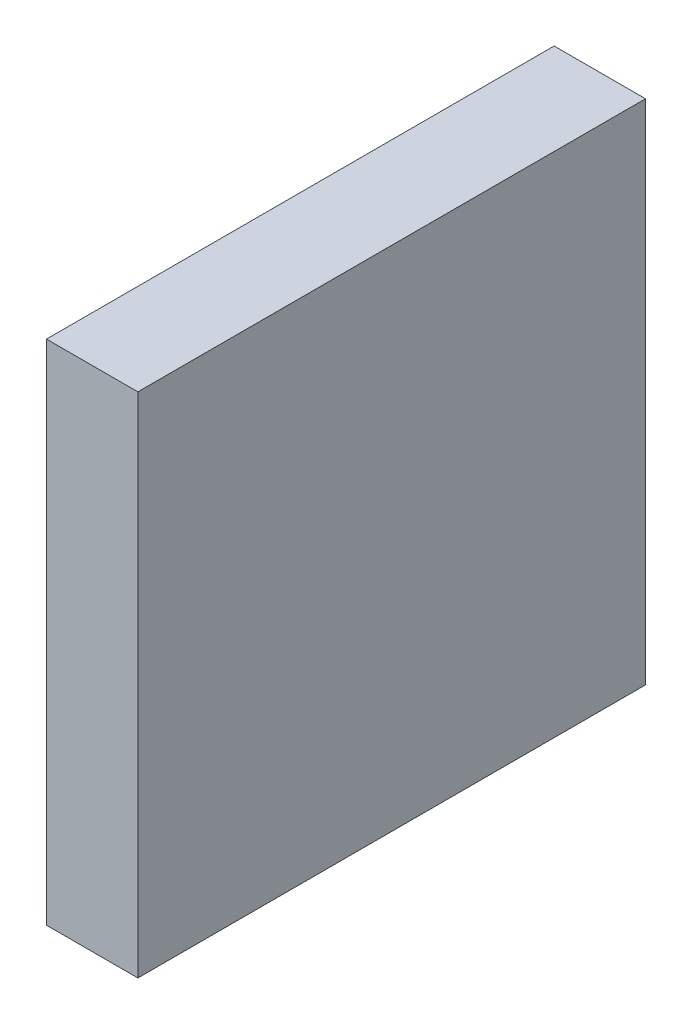
ISO-10303-21;
HEADER;
FILE_DESCRIPTION(('STEP AP214'),'2;1');
FILE_NAME('part.step','',(''),(''),'','','');
FILE_SCHEMA(('AUTOMOTIVE_DESIGN { 1 0 10303 214 1 1 1 1 }'));
ENDSEC;
DATA;
#1=APPLICATION_CONTEXT('core data for automotive mechanical design processes');
#2=APPLICATION_PROTOCOL_DEFINITION('international standard','automotive_design',2000,#1);
#3=PRODUCT_CONTEXT('',#1,'mechanical');
#4=PRODUCT('Part','Part','',(#3));
#5=PRODUCT_RELATED_PRODUCT_CATEGORY('part','',(#4));
#6=PRODUCT_DEFINITION_FORMATION('','',#4);
#7=PRODUCT_DEFINITION_CONTEXT('part definition',#1,'design');
#8=PRODUCT_DEFINITION('design','',#6,#7);
#9=PRODUCT_DEFINITION_SHAPE('','',#8);
#10=(LENGTH_UNIT() NAMED_UNIT(*) SI_UNIT(.MILLI.,.METRE.));
#11=(NAMED_UNIT(*) PLANE_ANGLE_UNIT() SI_UNIT($,.RADIAN.));
#12=(NAMED_UNIT(*) SI_UNIT($,.STERADIAN.) SOLID_ANGLE_UNIT());
#13=UNCERTAINTY_MEASURE_WITH_UNIT(LENGTH_MEASURE(1.E-05),#10,'distance_accuracy_value','');
#14=(GEOMETRIC_REPRESENTATION_CONTEXT(3) GLOBAL_UNCERTAINTY_ASSIGNED_CONTEXT((#13)) GLOBAL_UNIT_ASSIGNED_CONTEXT((#10,
#11,#12)) REPRESENTATION_CONTEXT('',''));
#15=CARTESIAN_POINT('',(0.,0.,0.));
#16=DIRECTION('',(0.,0.,1.));
#17=DIRECTION('',(1.,0.,0.));
#18=AXIS2_PLACEMENT_3D('',#15,#16,#17);
#19=CARTESIAN_POINT('',(4.5,-12.5,-12.5));
#20=DIRECTION('',(0.,0.,1.));
#21=DIRECTION('',(1.,0.,0.));
#22=AXIS2_PLACEMENT_3D('',#19,#20,#21);
#23=PLANE('',#22);
#24=DIRECTION('',(0.,1.,0.));
#25=VECTOR('',#24,1.);
#26=CARTESIAN_POINT('',(0.,-12.5,-12.5));
#27=LINE('',#26,#25);
#28=CARTESIAN_POINT('',(0.,-12.5,-12.5));
#29=VERTEX_POINT('',#28);
#30=CARTESIAN_POINT('',(0.,12.5,-12.5));
#31=VERTEX_POINT('',#30);
#32=EDGE_CURVE('E103',#29,#31,#27,.T.);
#33=ORIENTED_EDGE('',*,*,#32,.T.);
#34=DIRECTION('',(-1.,0.,0.));
#35=VECTOR('',#34,1.);
#36=CARTESIAN_POINT('',(4.5,12.5,-12.5));
#37=LINE('',#36,#35);
#38=CARTESIAN_POINT('',(4.5,12.5,-12.5));
#39=VERTEX_POINT('',#38);
#40=EDGE_CURVE('E11',#39,#31,#37,.T.);
#41=ORIENTED_EDGE('',*,*,#40,.F.);
#42=DIRECTION('',(0.,1.,0.));
#43=VECTOR('',#42,1.);
#44=CARTESIAN_POINT('',(4.5,-12.5,-12.5));
#45=LINE('',#44,#43);
#46=CARTESIAN_POINT('',(4.5,-12.5,-12.5));
#47=VERTEX_POINT('',#46);
#48=EDGE_CURVE('E91',#47,#39,#45,.T.);
#49=ORIENTED_EDGE('',*,*,#48,.F.);
#50=DIRECTION('',(-1.,0.,0.));
#51=VECTOR('',#50,1.);
#52=CARTESIAN_POINT('',(4.5,-12.5,-12.5));
#53=LINE('',#52,#51);
#54=EDGE_CURVE('E99',#47,#29,#53,.T.);
#55=ORIENTED_EDGE('',*,*,#54,.T.);
#56=EDGE_LOOP('',(#33,#41,#49,#55));
#57=FACE_BOUND('',#56,.T.);
#58=ADVANCED_FACE('F40',(#57),#23,.F.);
#59=CARTESIAN_POINT('',(4.5,12.5,12.5));
#60=DIRECTION('',(0.,-1.,0.));
#61=DIRECTION('',(0.,0.,-1.));
#62=AXIS2_PLACEMENT_3D('',#59,#60,#61);
#63=PLANE('',#62);
#64=DIRECTION('',(0.,0.,1.));
#65=VECTOR('',#64,1.);
#66=CARTESIAN_POINT('',(0.,12.5,12.5));
#67=LINE('',#66,#65);
#68=CARTESIAN_POINT('',(0.,12.5,12.5));
#69=VERTEX_POINT('',#68);
#70=EDGE_CURVE('E95',#31,#69,#67,.T.);
#71=ORIENTED_EDGE('',*,*,#70,.T.);
#72=DIRECTION('',(-1.,0.,0.));
#73=VECTOR('',#72,1.);
#74=CARTESIAN_POINT('',(4.5,12.5,12.5));
#75=LINE('',#74,#73);
#76=CARTESIAN_POINT('',(4.5,12.5,12.5));
#77=VERTEX_POINT('',#76);
#78=EDGE_CURVE('E48',#77,#69,#75,.T.);
#79=ORIENTED_EDGE('',*,*,#78,.F.);
#80=DIRECTION('',(0.,0.,1.));
#81=VECTOR('',#80,1.);
#82=CARTESIAN_POINT('',(4.5,12.5,12.5));
#83=LINE('',#82,#81);
#84=EDGE_CURVE('E86',#39,#77,#83,.T.);
#85=ORIENTED_EDGE('',*,*,#84,.F.);
#86=ORIENTED_EDGE('',*,*,#40,.T.);
#87=EDGE_LOOP('',(#71,#79,#85,#86));
#88=FACE_BOUND('',#87,.T.);
#89=ADVANCED_FACE('F94',(#88),#63,.F.);
#90=CARTESIAN_POINT('',(4.5,-12.5,12.5));
#91=DIRECTION('',(0.,0.,-1.));
#92=DIRECTION('',(-1.,0.,0.));
#93=AXIS2_PLACEMENT_3D('',#90,#91,#92);
#94=PLANE('',#93);
#95=DIRECTION('',(0.,-1.,0.));
#96=VECTOR('',#95,1.);
#97=CARTESIAN_POINT('',(0.,-12.5,12.5));
#98=LINE('',#97,#96);
#99=CARTESIAN_POINT('',(0.,-12.5,12.5));
#100=VERTEX_POINT('',#99);
#101=EDGE_CURVE('E73',#69,#100,#98,.T.);
#102=ORIENTED_EDGE('',*,*,#101,.T.);
#103=DIRECTION('',(-1.,0.,0.));
#104=VECTOR('',#103,1.);
#105=CARTESIAN_POINT('',(4.5,-12.5,12.5));
#106=LINE('',#105,#104);
#107=CARTESIAN_POINT('',(4.5,-12.5,12.5));
#108=VERTEX_POINT('',#107);
#109=EDGE_CURVE('E96',#108,#100,#106,.T.);
#110=ORIENTED_EDGE('',*,*,#109,.F.);
#111=DIRECTION('',(0.,-1.,0.));
#112=VECTOR('',#111,1.);
#113=CARTESIAN_POINT('',(4.5,-12.5,12.5));
#114=LINE('',#113,#112);
#115=EDGE_CURVE('E89',#77,#108,#114,.T.);
#116=ORIENTED_EDGE('',*,*,#115,.F.);
#117=ORIENTED_EDGE('',*,*,#78,.T.);
#118=EDGE_LOOP('',(#102,#110,#116,#117));
#119=FACE_BOUND('',#118,.T.);
#120=ADVANCED_FACE('F97',(#119),#94,.F.);
#121=CARTESIAN_POINT('',(4.5,-12.5,12.5));
#122=DIRECTION('',(0.,1.,0.));
#123=DIRECTION('',(0.,0.,1.));
#124=AXIS2_PLACEMENT_3D('',#121,#122,#123);
#125=PLANE('',#124);
#126=DIRECTION('',(0.,0.,-1.));
#127=VECTOR('',#126,1.);
#128=CARTESIAN_POINT('',(0.,-12.5,12.5));
#129=LINE('',#128,#127);
#130=EDGE_CURVE('E79',#100,#29,#129,.T.);
#131=ORIENTED_EDGE('',*,*,#130,.T.);
#132=ORIENTED_EDGE('',*,*,#54,.F.);
#133=DIRECTION('',(0.,0.,-1.));
#134=VECTOR('',#133,1.);
#135=CARTESIAN_POINT('',(4.5,-12.5,12.5));
#136=LINE('',#135,#134);
#137=EDGE_CURVE('E56',#108,#47,#136,.T.);
#138=ORIENTED_EDGE('',*,*,#137,.F.);
#139=ORIENTED_EDGE('',*,*,#109,.T.);
#140=EDGE_LOOP('',(#131,#132,#138,#139));
#141=FACE_BOUND('',#140,.T.);
#142=ADVANCED_FACE('F110',(#141),#125,.F.);
#143=CARTESIAN_POINT('',(4.5,0.,0.));
#144=DIRECTION('',(-1.,0.,0.));
#145=DIRECTION('',(0.,0.,1.));
#146=AXIS2_PLACEMENT_3D('',#143,#144,#145);
#147=PLANE('',#146);
#148=ORIENTED_EDGE('',*,*,#48,.T.);
#149=ORIENTED_EDGE('',*,*,#84,.T.);
#150=ORIENTED_EDGE('',*,*,#115,.T.);
#151=ORIENTED_EDGE('',*,*,#137,.T.);
#152=EDGE_LOOP('',(#148,#149,#150,#151));
#153=FACE_BOUND('',#152,.T.);
#154=ADVANCED_FACE('F87',(#153),#147,.F.);
#155=CARTESIAN_POINT('',(0.,0.,0.));
#156=DIRECTION('',(-1.,0.,0.));
#157=DIRECTION('',(0.,0.,1.));
#158=AXIS2_PLACEMENT_3D('',#155,#156,#157);
#159=PLANE('',#158);
#160=ORIENTED_EDGE('',*,*,#32,.F.);
#161=ORIENTED_EDGE('',*,*,#130,.F.);
#162=ORIENTED_EDGE('',*,*,#101,.F.);
#163=ORIENTED_EDGE('',*,*,#70,.F.);
#164=EDGE_LOOP('',(#160,#161,#162,#163));
#165=FACE_BOUND('',#164,.T.);
#166=ADVANCED_FACE('F113',(#165),#159,.T.);
#167=CLOSED_SHELL('',(#58,#89,#120,#142,#154,#166));
#168=MANIFOLD_SOLID_BREP('B2',#167);
#169=ADVANCED_BREP_SHAPE_REPRESENTATION('',(#18,#168),#14);
#170=SHAPE_DEFINITION_REPRESENTATION(#9,#169);
ENDSEC;
END-ISO-10303-21;
